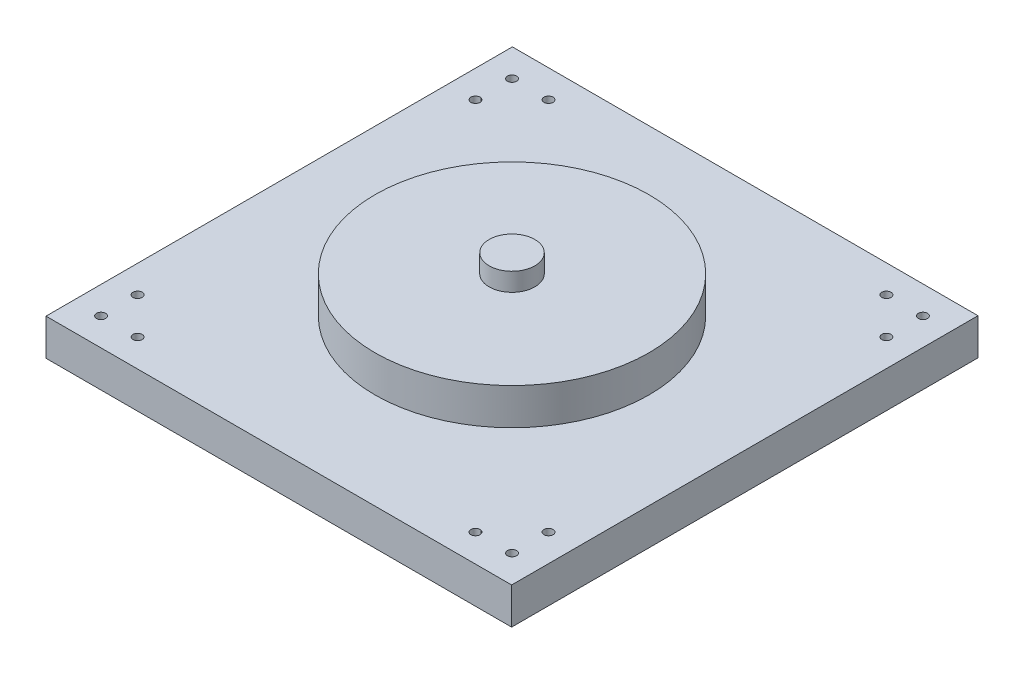
ISO-10303-21;
HEADER;
FILE_DESCRIPTION(('STEP AP214'),'2;1');
FILE_NAME('part.step','',(''),(''),'','','');
FILE_SCHEMA(('AUTOMOTIVE_DESIGN { 1 0 10303 214 1 1 1 1 }'));
ENDSEC;
DATA;
#1=APPLICATION_CONTEXT('core data for automotive mechanical design processes');
#2=APPLICATION_PROTOCOL_DEFINITION('international standard','automotive_design',2000,#1);
#3=PRODUCT_CONTEXT('',#1,'mechanical');
#4=PRODUCT('Part','Part','',(#3));
#5=PRODUCT_RELATED_PRODUCT_CATEGORY('part','',(#4));
#6=PRODUCT_DEFINITION_FORMATION('','',#4);
#7=PRODUCT_DEFINITION_CONTEXT('part definition',#1,'design');
#8=PRODUCT_DEFINITION('design','',#6,#7);
#9=PRODUCT_DEFINITION_SHAPE('','',#8);
#10=(LENGTH_UNIT() NAMED_UNIT(*) SI_UNIT(.MILLI.,.METRE.));
#11=(NAMED_UNIT(*) PLANE_ANGLE_UNIT() SI_UNIT($,.RADIAN.));
#12=(NAMED_UNIT(*) SI_UNIT($,.STERADIAN.) SOLID_ANGLE_UNIT());
#13=UNCERTAINTY_MEASURE_WITH_UNIT(LENGTH_MEASURE(1.E-05),#10,'distance_accuracy_value','');
#14=(GEOMETRIC_REPRESENTATION_CONTEXT(3) GLOBAL_UNCERTAINTY_ASSIGNED_CONTEXT((#13)) GLOBAL_UNIT_ASSIGNED_CONTEXT((#10,
#11,#12)) REPRESENTATION_CONTEXT('',''));
#15=CARTESIAN_POINT('',(0.,0.,0.));
#16=DIRECTION('',(0.,0.,1.));
#17=DIRECTION('',(1.,0.,0.));
#18=AXIS2_PLACEMENT_3D('',#15,#16,#17);
#19=CARTESIAN_POINT('',(0.,5.08,0.));
#20=DIRECTION('',(0.,-1.,0.));
#21=DIRECTION('',(0.,0.,-1.));
#22=AXIS2_PLACEMENT_3D('',#19,#20,#21);
#23=PLANE('',#22);
#24=CARTESIAN_POINT('',(0.,5.08,0.));
#25=DIRECTION('',(0.,1.,0.));
#26=DIRECTION('',(0.,0.,1.));
#27=AXIS2_PLACEMENT_3D('',#24,#25,#26);
#28=CIRCLE('',#27,19.05);
#29=CARTESIAN_POINT('',(0.,5.08,19.05));
#30=VERTEX_POINT('',#29);
#31=EDGE_CURVE('E50',#30,#30,#28,.T.);
#32=ORIENTED_EDGE('',*,*,#31,.F.);
#33=EDGE_LOOP('',(#32));
#34=FACE_BOUND('',#33,.T.);
#35=DIRECTION('',(0.,0.,-1.));
#36=VECTOR('',#35,1.);
#37=CARTESIAN_POINT('',(32.37851115788,5.08,32.4304660476962));
#38=LINE('',#37,#36);
#39=CARTESIAN_POINT('',(32.37851115788,5.08,32.4304660476962));
#40=VERTEX_POINT('',#39);
#41=CARTESIAN_POINT('',(32.37851115788,5.08,-32.4304660476962));
#42=VERTEX_POINT('',#41);
#43=EDGE_CURVE('E98',#40,#42,#38,.T.);
#44=ORIENTED_EDGE('',*,*,#43,.T.);
#45=DIRECTION('',(-1.,0.,0.));
#46=VECTOR('',#45,1.);
#47=CARTESIAN_POINT('',(-32.37851115788,5.08,-32.4304660476962));
#48=LINE('',#47,#46);
#49=CARTESIAN_POINT('',(-32.37851115788,5.08,-32.4304660476962));
#50=VERTEX_POINT('',#49);
#51=EDGE_CURVE('E93',#42,#50,#48,.T.);
#52=ORIENTED_EDGE('',*,*,#51,.T.);
#53=DIRECTION('',(0.,0.,1.));
#54=VECTOR('',#53,1.);
#55=CARTESIAN_POINT('',(-32.37851115788,5.08,32.4304660476962));
#56=LINE('',#55,#54);
#57=CARTESIAN_POINT('',(-32.37851115788,5.08,32.4304660476962));
#58=VERTEX_POINT('',#57);
#59=EDGE_CURVE('E96',#50,#58,#56,.T.);
#60=ORIENTED_EDGE('',*,*,#59,.T.);
#61=DIRECTION('',(1.,0.,0.));
#62=VECTOR('',#61,1.);
#63=CARTESIAN_POINT('',(-32.37851115788,5.08,32.4304660476962));
#64=LINE('',#63,#62);
#65=EDGE_CURVE('E59',#58,#40,#64,.T.);
#66=ORIENTED_EDGE('',*,*,#65,.T.);
#67=EDGE_LOOP('',(#44,#52,#60,#66));
#68=FACE_BOUND('',#67,.T.);
#69=CARTESIAN_POINT('',(-28.575,5.08,-28.575));
#70=DIRECTION('',(0.,1.,0.));
#71=DIRECTION('',(0.,0.,1.));
#72=AXIS2_PLACEMENT_3D('',#69,#70,#71);
#73=CIRCLE('',#72,0.634999999999999);
#74=CARTESIAN_POINT('',(-28.575,5.08,-27.94));
#75=VERTEX_POINT('',#74);
#76=EDGE_CURVE('E116',#75,#75,#73,.T.);
#77=ORIENTED_EDGE('',*,*,#76,.F.);
#78=EDGE_LOOP('',(#77));
#79=FACE_BOUND('',#78,.T.);
#80=CARTESIAN_POINT('',(-23.495,5.08,-28.575));
#81=DIRECTION('',(0.,1.,0.));
#82=DIRECTION('',(0.,0.,1.));
#83=AXIS2_PLACEMENT_3D('',#80,#81,#82);
#84=CIRCLE('',#83,0.635000000000003);
#85=CARTESIAN_POINT('',(-23.495,5.08,-27.94));
#86=VERTEX_POINT('',#85);
#87=EDGE_CURVE('E137',#86,#86,#84,.T.);
#88=ORIENTED_EDGE('',*,*,#87,.F.);
#89=EDGE_LOOP('',(#88));
#90=FACE_BOUND('',#89,.T.);
#91=CARTESIAN_POINT('',(-28.575,5.08,-23.495));
#92=DIRECTION('',(0.,1.,0.));
#93=DIRECTION('',(0.,0.,1.));
#94=AXIS2_PLACEMENT_3D('',#91,#92,#93);
#95=CIRCLE('',#94,0.634999999999999);
#96=CARTESIAN_POINT('',(-28.575,5.08,-22.86));
#97=VERTEX_POINT('',#96);
#98=EDGE_CURVE('E143',#97,#97,#95,.T.);
#99=ORIENTED_EDGE('',*,*,#98,.F.);
#100=EDGE_LOOP('',(#99));
#101=FACE_BOUND('',#100,.T.);
#102=CARTESIAN_POINT('',(28.575,5.08,-28.575));
#103=DIRECTION('',(0.,1.,0.));
#104=DIRECTION('',(0.,0.,1.));
#105=AXIS2_PLACEMENT_3D('',#102,#103,#104);
#106=CIRCLE('',#105,0.634999999999995);
#107=CARTESIAN_POINT('',(28.575,5.08,-27.94));
#108=VERTEX_POINT('',#107);
#109=EDGE_CURVE('E149',#108,#108,#106,.T.);
#110=ORIENTED_EDGE('',*,*,#109,.F.);
#111=EDGE_LOOP('',(#110));
#112=FACE_BOUND('',#111,.T.);
#113=CARTESIAN_POINT('',(23.495,5.08,-28.575));
#114=DIRECTION('',(0.,1.,0.));
#115=DIRECTION('',(0.,0.,1.));
#116=AXIS2_PLACEMENT_3D('',#113,#114,#115);
#117=CIRCLE('',#116,0.634999999999995);
#118=CARTESIAN_POINT('',(23.495,5.08,-27.94));
#119=VERTEX_POINT('',#118);
#120=EDGE_CURVE('E156',#119,#119,#117,.T.);
#121=ORIENTED_EDGE('',*,*,#120,.F.);
#122=EDGE_LOOP('',(#121));
#123=FACE_BOUND('',#122,.T.);
#124=CARTESIAN_POINT('',(28.575,5.08,-23.495));
#125=DIRECTION('',(0.,1.,0.));
#126=DIRECTION('',(0.,0.,1.));
#127=AXIS2_PLACEMENT_3D('',#124,#125,#126);
#128=CIRCLE('',#127,0.635000000000003);
#129=CARTESIAN_POINT('',(28.575,5.08,-22.86));
#130=VERTEX_POINT('',#129);
#131=EDGE_CURVE('E163',#130,#130,#128,.T.);
#132=ORIENTED_EDGE('',*,*,#131,.F.);
#133=EDGE_LOOP('',(#132));
#134=FACE_BOUND('',#133,.T.);
#135=CARTESIAN_POINT('',(28.575,5.08,28.575));
#136=DIRECTION('',(0.,1.,0.));
#137=DIRECTION('',(0.,0.,1.));
#138=AXIS2_PLACEMENT_3D('',#135,#136,#137);
#139=CIRCLE('',#138,0.634999999999995);
#140=CARTESIAN_POINT('',(28.575,5.08,29.21));
#141=VERTEX_POINT('',#140);
#142=EDGE_CURVE('E170',#141,#141,#139,.T.);
#143=ORIENTED_EDGE('',*,*,#142,.F.);
#144=EDGE_LOOP('',(#143));
#145=FACE_BOUND('',#144,.T.);
#146=CARTESIAN_POINT('',(28.575,5.08,23.495));
#147=DIRECTION('',(0.,1.,0.));
#148=DIRECTION('',(0.,0.,1.));
#149=AXIS2_PLACEMENT_3D('',#146,#147,#148);
#150=CIRCLE('',#149,0.635000000000003);
#151=CARTESIAN_POINT('',(28.575,5.08,24.13));
#152=VERTEX_POINT('',#151);
#153=EDGE_CURVE('E177',#152,#152,#150,.T.);
#154=ORIENTED_EDGE('',*,*,#153,.F.);
#155=EDGE_LOOP('',(#154));
#156=FACE_BOUND('',#155,.T.);
#157=CARTESIAN_POINT('',(23.495,5.08,28.575));
#158=DIRECTION('',(0.,1.,0.));
#159=DIRECTION('',(0.,0.,1.));
#160=AXIS2_PLACEMENT_3D('',#157,#158,#159);
#161=CIRCLE('',#160,0.634999999999995);
#162=CARTESIAN_POINT('',(23.495,5.08,29.21));
#163=VERTEX_POINT('',#162);
#164=EDGE_CURVE('E183',#163,#163,#161,.T.);
#165=ORIENTED_EDGE('',*,*,#164,.F.);
#166=EDGE_LOOP('',(#165));
#167=FACE_BOUND('',#166,.T.);
#168=CARTESIAN_POINT('',(-28.575,5.08,28.575));
#169=DIRECTION('',(0.,1.,0.));
#170=DIRECTION('',(0.,0.,1.));
#171=AXIS2_PLACEMENT_3D('',#168,#169,#170);
#172=CIRCLE('',#171,0.634999999999999);
#173=CARTESIAN_POINT('',(-28.575,5.08,29.21));
#174=VERTEX_POINT('',#173);
#175=EDGE_CURVE('E189',#174,#174,#172,.T.);
#176=ORIENTED_EDGE('',*,*,#175,.F.);
#177=EDGE_LOOP('',(#176));
#178=FACE_BOUND('',#177,.T.);
#179=CARTESIAN_POINT('',(-28.575,5.08,23.495));
#180=DIRECTION('',(0.,1.,0.));
#181=DIRECTION('',(0.,0.,1.));
#182=AXIS2_PLACEMENT_3D('',#179,#180,#181);
#183=CIRCLE('',#182,0.634999999999999);
#184=CARTESIAN_POINT('',(-28.575,5.08,24.13));
#185=VERTEX_POINT('',#184);
#186=EDGE_CURVE('E196',#185,#185,#183,.T.);
#187=ORIENTED_EDGE('',*,*,#186,.F.);
#188=EDGE_LOOP('',(#187));
#189=FACE_BOUND('',#188,.T.);
#190=CARTESIAN_POINT('',(-23.495,5.08,28.575));
#191=DIRECTION('',(0.,1.,0.));
#192=DIRECTION('',(0.,0.,1.));
#193=AXIS2_PLACEMENT_3D('',#190,#191,#192);
#194=CIRCLE('',#193,0.634999999999999);
#195=CARTESIAN_POINT('',(-23.495,5.08,29.21));
#196=VERTEX_POINT('',#195);
#197=EDGE_CURVE('E203',#196,#196,#194,.T.);
#198=ORIENTED_EDGE('',*,*,#197,.F.);
#199=EDGE_LOOP('',(#198));
#200=FACE_BOUND('',#199,.T.);
#201=ADVANCED_FACE('F39',(#34,#68,#79,#90,#101,#112,#123,#134,#145,#156,#167,#178,#189,#200),
#23,.F.);
#202=CARTESIAN_POINT('',(0.,0.,0.));
#203=DIRECTION('',(0.,-1.,0.));
#204=DIRECTION('',(0.,0.,-1.));
#205=AXIS2_PLACEMENT_3D('',#202,#203,#204);
#206=PLANE('',#205);
#207=CARTESIAN_POINT('',(-28.575,0.,23.495));
#208=DIRECTION('',(0.,1.,0.));
#209=DIRECTION('',(0.,0.,1.));
#210=AXIS2_PLACEMENT_3D('',#207,#208,#209);
#211=CIRCLE('',#210,0.634999999999999);
#212=CARTESIAN_POINT('',(-28.575,0.,24.13));
#213=VERTEX_POINT('',#212);
#214=EDGE_CURVE('E199',#213,#213,#211,.T.);
#215=ORIENTED_EDGE('',*,*,#214,.T.);
#216=EDGE_LOOP('',(#215));
#217=FACE_BOUND('',#216,.T.);
#218=CARTESIAN_POINT('',(23.495,0.,28.575));
#219=DIRECTION('',(0.,1.,0.));
#220=DIRECTION('',(0.,0.,1.));
#221=AXIS2_PLACEMENT_3D('',#218,#219,#220);
#222=CIRCLE('',#221,0.634999999999995);
#223=CARTESIAN_POINT('',(23.495,0.,29.21));
#224=VERTEX_POINT('',#223);
#225=EDGE_CURVE('E186',#224,#224,#222,.T.);
#226=ORIENTED_EDGE('',*,*,#225,.T.);
#227=EDGE_LOOP('',(#226));
#228=FACE_BOUND('',#227,.T.);
#229=CARTESIAN_POINT('',(28.575,0.,28.575));
#230=DIRECTION('',(0.,1.,0.));
#231=DIRECTION('',(0.,0.,1.));
#232=AXIS2_PLACEMENT_3D('',#229,#230,#231);
#233=CIRCLE('',#232,0.634999999999995);
#234=CARTESIAN_POINT('',(28.575,0.,29.21));
#235=VERTEX_POINT('',#234);
#236=EDGE_CURVE('E174',#235,#235,#233,.T.);
#237=ORIENTED_EDGE('',*,*,#236,.T.);
#238=EDGE_LOOP('',(#237));
#239=FACE_BOUND('',#238,.T.);
#240=CARTESIAN_POINT('',(23.495,0.,-28.575));
#241=DIRECTION('',(0.,1.,0.));
#242=DIRECTION('',(0.,0.,1.));
#243=AXIS2_PLACEMENT_3D('',#240,#241,#242);
#244=CIRCLE('',#243,0.634999999999995);
#245=CARTESIAN_POINT('',(23.495,0.,-27.94));
#246=VERTEX_POINT('',#245);
#247=EDGE_CURVE('E160',#246,#246,#244,.T.);
#248=ORIENTED_EDGE('',*,*,#247,.T.);
#249=EDGE_LOOP('',(#248));
#250=FACE_BOUND('',#249,.T.);
#251=CARTESIAN_POINT('',(-28.575,0.,-23.495));
#252=DIRECTION('',(0.,1.,0.));
#253=DIRECTION('',(0.,0.,1.));
#254=AXIS2_PLACEMENT_3D('',#251,#252,#253);
#255=CIRCLE('',#254,0.634999999999999);
#256=CARTESIAN_POINT('',(-28.575,0.,-22.86));
#257=VERTEX_POINT('',#256);
#258=EDGE_CURVE('E146',#257,#257,#255,.T.);
#259=ORIENTED_EDGE('',*,*,#258,.T.);
#260=EDGE_LOOP('',(#259));
#261=FACE_BOUND('',#260,.T.);
#262=CARTESIAN_POINT('',(-28.575,0.,-28.575));
#263=DIRECTION('',(0.,1.,0.));
#264=DIRECTION('',(0.,0.,1.));
#265=AXIS2_PLACEMENT_3D('',#262,#263,#264);
#266=CIRCLE('',#265,0.634999999999999);
#267=CARTESIAN_POINT('',(-28.575,0.,-27.94));
#268=VERTEX_POINT('',#267);
#269=EDGE_CURVE('E134',#268,#268,#266,.T.);
#270=ORIENTED_EDGE('',*,*,#269,.T.);
#271=EDGE_LOOP('',(#270));
#272=FACE_BOUND('',#271,.T.);
#273=DIRECTION('',(0.,0.,-1.));
#274=VECTOR('',#273,1.);
#275=CARTESIAN_POINT('',(32.37851115788,0.,32.4304660476962));
#276=LINE('',#275,#274);
#277=CARTESIAN_POINT('',(32.37851115788,0.,32.4304660476962));
#278=VERTEX_POINT('',#277);
#279=CARTESIAN_POINT('',(32.37851115788,0.,-32.4304660476962));
#280=VERTEX_POINT('',#279);
#281=EDGE_CURVE('E112',#278,#280,#276,.T.);
#282=ORIENTED_EDGE('',*,*,#281,.F.);
#283=DIRECTION('',(1.,0.,0.));
#284=VECTOR('',#283,1.);
#285=CARTESIAN_POINT('',(-32.37851115788,0.,32.4304660476962));
#286=LINE('',#285,#284);
#287=CARTESIAN_POINT('',(-32.37851115788,0.,32.4304660476962));
#288=VERTEX_POINT('',#287);
#289=EDGE_CURVE('E84',#288,#278,#286,.T.);
#290=ORIENTED_EDGE('',*,*,#289,.F.);
#291=DIRECTION('',(0.,0.,1.));
#292=VECTOR('',#291,1.);
#293=CARTESIAN_POINT('',(-32.37851115788,0.,32.4304660476962));
#294=LINE('',#293,#292);
#295=CARTESIAN_POINT('',(-32.37851115788,0.,-32.4304660476962));
#296=VERTEX_POINT('',#295);
#297=EDGE_CURVE('E78',#296,#288,#294,.T.);
#298=ORIENTED_EDGE('',*,*,#297,.F.);
#299=DIRECTION('',(-1.,0.,0.));
#300=VECTOR('',#299,1.);
#301=CARTESIAN_POINT('',(-32.37851115788,0.,-32.4304660476962));
#302=LINE('',#301,#300);
#303=EDGE_CURVE('E104',#280,#296,#302,.T.);
#304=ORIENTED_EDGE('',*,*,#303,.F.);
#305=EDGE_LOOP('',(#282,#290,#298,#304));
#306=FACE_BOUND('',#305,.T.);
#307=CARTESIAN_POINT('',(-23.495,0.,-28.575));
#308=DIRECTION('',(0.,1.,0.));
#309=DIRECTION('',(0.,0.,1.));
#310=AXIS2_PLACEMENT_3D('',#307,#308,#309);
#311=CIRCLE('',#310,0.635000000000003);
#312=CARTESIAN_POINT('',(-23.495,0.,-27.94));
#313=VERTEX_POINT('',#312);
#314=EDGE_CURVE('E140',#313,#313,#311,.T.);
#315=ORIENTED_EDGE('',*,*,#314,.T.);
#316=EDGE_LOOP('',(#315));
#317=FACE_BOUND('',#316,.T.);
#318=CARTESIAN_POINT('',(28.575,0.,-28.575));
#319=DIRECTION('',(0.,1.,0.));
#320=DIRECTION('',(0.,0.,1.));
#321=AXIS2_PLACEMENT_3D('',#318,#319,#320);
#322=CIRCLE('',#321,0.634999999999995);
#323=CARTESIAN_POINT('',(28.575,0.,-27.94));
#324=VERTEX_POINT('',#323);
#325=EDGE_CURVE('E152',#324,#324,#322,.T.);
#326=ORIENTED_EDGE('',*,*,#325,.T.);
#327=EDGE_LOOP('',(#326));
#328=FACE_BOUND('',#327,.T.);
#329=CARTESIAN_POINT('',(28.575,0.,-23.495));
#330=DIRECTION('',(0.,1.,0.));
#331=DIRECTION('',(0.,0.,1.));
#332=AXIS2_PLACEMENT_3D('',#329,#330,#331);
#333=CIRCLE('',#332,0.635000000000003);
#334=CARTESIAN_POINT('',(28.575,0.,-22.86));
#335=VERTEX_POINT('',#334);
#336=EDGE_CURVE('E166',#335,#335,#333,.T.);
#337=ORIENTED_EDGE('',*,*,#336,.T.);
#338=EDGE_LOOP('',(#337));
#339=FACE_BOUND('',#338,.T.);
#340=CARTESIAN_POINT('',(28.575,0.,23.495));
#341=DIRECTION('',(0.,1.,0.));
#342=DIRECTION('',(0.,0.,1.));
#343=AXIS2_PLACEMENT_3D('',#340,#341,#342);
#344=CIRCLE('',#343,0.635000000000003);
#345=CARTESIAN_POINT('',(28.575,0.,24.13));
#346=VERTEX_POINT('',#345);
#347=EDGE_CURVE('E180',#346,#346,#344,.T.);
#348=ORIENTED_EDGE('',*,*,#347,.T.);
#349=EDGE_LOOP('',(#348));
#350=FACE_BOUND('',#349,.T.);
#351=CARTESIAN_POINT('',(-28.575,0.,28.575));
#352=DIRECTION('',(0.,1.,0.));
#353=DIRECTION('',(0.,0.,1.));
#354=AXIS2_PLACEMENT_3D('',#351,#352,#353);
#355=CIRCLE('',#354,0.634999999999999);
#356=CARTESIAN_POINT('',(-28.575,0.,29.21));
#357=VERTEX_POINT('',#356);
#358=EDGE_CURVE('E192',#357,#357,#355,.T.);
#359=ORIENTED_EDGE('',*,*,#358,.T.);
#360=EDGE_LOOP('',(#359));
#361=FACE_BOUND('',#360,.T.);
#362=CARTESIAN_POINT('',(-23.495,0.,28.575));
#363=DIRECTION('',(0.,1.,0.));
#364=DIRECTION('',(0.,0.,1.));
#365=AXIS2_PLACEMENT_3D('',#362,#363,#364);
#366=CIRCLE('',#365,0.634999999999999);
#367=CARTESIAN_POINT('',(-23.495,0.,29.21));
#368=VERTEX_POINT('',#367);
#369=EDGE_CURVE('E207',#368,#368,#366,.T.);
#370=ORIENTED_EDGE('',*,*,#369,.T.);
#371=EDGE_LOOP('',(#370));
#372=FACE_BOUND('',#371,.T.);
#373=ADVANCED_FACE('F129',(#217,#228,#239,#250,#261,#272,#306,#317,#328,#339,#350,#361,#372),
#206,.T.);
#374=CARTESIAN_POINT('',(32.37851115788,5.08,32.4304660476962));
#375=DIRECTION('',(-1.,0.,0.));
#376=DIRECTION('',(0.,0.,1.));
#377=AXIS2_PLACEMENT_3D('',#374,#375,#376);
#378=PLANE('',#377);
#379=ORIENTED_EDGE('',*,*,#281,.T.);
#380=DIRECTION('',(0.,-1.,0.));
#381=VECTOR('',#380,1.);
#382=CARTESIAN_POINT('',(32.37851115788,5.08,-32.4304660476962));
#383=LINE('',#382,#381);
#384=EDGE_CURVE('E43',#42,#280,#383,.T.);
#385=ORIENTED_EDGE('',*,*,#384,.F.);
#386=ORIENTED_EDGE('',*,*,#43,.F.);
#387=DIRECTION('',(0.,-1.,0.));
#388=VECTOR('',#387,1.);
#389=CARTESIAN_POINT('',(32.37851115788,5.08,32.4304660476962));
#390=LINE('',#389,#388);
#391=EDGE_CURVE('E108',#40,#278,#390,.T.);
#392=ORIENTED_EDGE('',*,*,#391,.T.);
#393=EDGE_LOOP('',(#379,#385,#386,#392));
#394=FACE_BOUND('',#393,.T.);
#395=ADVANCED_FACE('F41',(#394),#378,.F.);
#396=CARTESIAN_POINT('',(-32.37851115788,5.08,-32.4304660476962));
#397=DIRECTION('',(0.,0.,1.));
#398=DIRECTION('',(1.,0.,0.));
#399=AXIS2_PLACEMENT_3D('',#396,#397,#398);
#400=PLANE('',#399);
#401=ORIENTED_EDGE('',*,*,#303,.T.);
#402=DIRECTION('',(0.,-1.,0.));
#403=VECTOR('',#402,1.);
#404=CARTESIAN_POINT('',(-32.37851115788,5.08,-32.4304660476962));
#405=LINE('',#404,#403);
#406=EDGE_CURVE('E102',#50,#296,#405,.T.);
#407=ORIENTED_EDGE('',*,*,#406,.F.);
#408=ORIENTED_EDGE('',*,*,#51,.F.);
#409=ORIENTED_EDGE('',*,*,#384,.T.);
#410=EDGE_LOOP('',(#401,#407,#408,#409));
#411=FACE_BOUND('',#410,.T.);
#412=ADVANCED_FACE('F103',(#411),#400,.F.);
#413=CARTESIAN_POINT('',(-32.37851115788,5.08,32.4304660476962));
#414=DIRECTION('',(1.,0.,0.));
#415=DIRECTION('',(0.,0.,-1.));
#416=AXIS2_PLACEMENT_3D('',#413,#414,#415);
#417=PLANE('',#416);
#418=ORIENTED_EDGE('',*,*,#297,.T.);
#419=DIRECTION('',(0.,-1.,0.));
#420=VECTOR('',#419,1.);
#421=CARTESIAN_POINT('',(-32.37851115788,5.08,32.4304660476962));
#422=LINE('',#421,#420);
#423=EDGE_CURVE('E105',#58,#288,#422,.T.);
#424=ORIENTED_EDGE('',*,*,#423,.F.);
#425=ORIENTED_EDGE('',*,*,#59,.F.);
#426=ORIENTED_EDGE('',*,*,#406,.T.);
#427=EDGE_LOOP('',(#418,#424,#425,#426));
#428=FACE_BOUND('',#427,.T.);
#429=ADVANCED_FACE('F106',(#428),#417,.F.);
#430=CARTESIAN_POINT('',(-32.37851115788,5.08,32.4304660476962));
#431=DIRECTION('',(0.,0.,-1.));
#432=DIRECTION('',(-1.,0.,0.));
#433=AXIS2_PLACEMENT_3D('',#430,#431,#432);
#434=PLANE('',#433);
#435=ORIENTED_EDGE('',*,*,#289,.T.);
#436=ORIENTED_EDGE('',*,*,#391,.F.);
#437=ORIENTED_EDGE('',*,*,#65,.F.);
#438=ORIENTED_EDGE('',*,*,#423,.T.);
#439=EDGE_LOOP('',(#435,#436,#437,#438));
#440=FACE_BOUND('',#439,.T.);
#441=ADVANCED_FACE('F126',(#440),#434,.F.);
#442=CARTESIAN_POINT('',(-28.575,5.08,-28.575));
#443=DIRECTION('',(0.,-1.,0.));
#444=DIRECTION('',(0.,0.,-1.));
#445=AXIS2_PLACEMENT_3D('',#442,#443,#444);
#446=CYLINDRICAL_SURFACE('',#445,0.634999999999999);
#447=ORIENTED_EDGE('',*,*,#76,.T.);
#448=EDGE_LOOP('',(#447));
#449=FACE_BOUND('',#448,.T.);
#450=ORIENTED_EDGE('',*,*,#269,.F.);
#451=EDGE_LOOP('',(#450));
#452=FACE_BOUND('',#451,.T.);
#453=ADVANCED_FACE('F255',(#449,#452),#446,.F.);
#454=CARTESIAN_POINT('',(-23.495,5.08,-28.575));
#455=DIRECTION('',(0.,-1.,0.));
#456=DIRECTION('',(0.,0.,-1.));
#457=AXIS2_PLACEMENT_3D('',#454,#455,#456);
#458=CYLINDRICAL_SURFACE('',#457,0.635000000000003);
#459=ORIENTED_EDGE('',*,*,#87,.T.);
#460=EDGE_LOOP('',(#459));
#461=FACE_BOUND('',#460,.T.);
#462=ORIENTED_EDGE('',*,*,#314,.F.);
#463=EDGE_LOOP('',(#462));
#464=FACE_BOUND('',#463,.T.);
#465=ADVANCED_FACE('F377',(#461,#464),#458,.F.);
#466=CARTESIAN_POINT('',(-28.575,5.08,-23.495));
#467=DIRECTION('',(0.,-1.,0.));
#468=DIRECTION('',(0.,0.,-1.));
#469=AXIS2_PLACEMENT_3D('',#466,#467,#468);
#470=CYLINDRICAL_SURFACE('',#469,0.634999999999999);
#471=ORIENTED_EDGE('',*,*,#98,.T.);
#472=EDGE_LOOP('',(#471));
#473=FACE_BOUND('',#472,.T.);
#474=ORIENTED_EDGE('',*,*,#258,.F.);
#475=EDGE_LOOP('',(#474));
#476=FACE_BOUND('',#475,.T.);
#477=ADVANCED_FACE('F369',(#473,#476),#470,.F.);
#478=CARTESIAN_POINT('',(28.575,5.08,-28.575));
#479=DIRECTION('',(0.,-1.,0.));
#480=DIRECTION('',(0.,0.,-1.));
#481=AXIS2_PLACEMENT_3D('',#478,#479,#480);
#482=CYLINDRICAL_SURFACE('',#481,0.634999999999995);
#483=ORIENTED_EDGE('',*,*,#109,.T.);
#484=EDGE_LOOP('',(#483));
#485=FACE_BOUND('',#484,.T.);
#486=ORIENTED_EDGE('',*,*,#325,.F.);
#487=EDGE_LOOP('',(#486));
#488=FACE_BOUND('',#487,.T.);
#489=ADVANCED_FACE('F361',(#485,#488),#482,.F.);
#490=CARTESIAN_POINT('',(23.495,5.08,-28.575));
#491=DIRECTION('',(0.,-1.,0.));
#492=DIRECTION('',(0.,0.,-1.));
#493=AXIS2_PLACEMENT_3D('',#490,#491,#492);
#494=CYLINDRICAL_SURFACE('',#493,0.634999999999995);
#495=ORIENTED_EDGE('',*,*,#120,.T.);
#496=EDGE_LOOP('',(#495));
#497=FACE_BOUND('',#496,.T.);
#498=ORIENTED_EDGE('',*,*,#247,.F.);
#499=EDGE_LOOP('',(#498));
#500=FACE_BOUND('',#499,.T.);
#501=ADVANCED_FACE('F353',(#497,#500),#494,.F.);
#502=CARTESIAN_POINT('',(28.575,5.08,-23.495));
#503=DIRECTION('',(0.,-1.,0.));
#504=DIRECTION('',(0.,0.,-1.));
#505=AXIS2_PLACEMENT_3D('',#502,#503,#504);
#506=CYLINDRICAL_SURFACE('',#505,0.635000000000003);
#507=ORIENTED_EDGE('',*,*,#131,.T.);
#508=EDGE_LOOP('',(#507));
#509=FACE_BOUND('',#508,.T.);
#510=ORIENTED_EDGE('',*,*,#336,.F.);
#511=EDGE_LOOP('',(#510));
#512=FACE_BOUND('',#511,.T.);
#513=ADVANCED_FACE('F345',(#509,#512),#506,.F.);
#514=CARTESIAN_POINT('',(28.575,5.08,28.575));
#515=DIRECTION('',(0.,-1.,0.));
#516=DIRECTION('',(0.,0.,-1.));
#517=AXIS2_PLACEMENT_3D('',#514,#515,#516);
#518=CYLINDRICAL_SURFACE('',#517,0.634999999999995);
#519=ORIENTED_EDGE('',*,*,#142,.T.);
#520=EDGE_LOOP('',(#519));
#521=FACE_BOUND('',#520,.T.);
#522=ORIENTED_EDGE('',*,*,#236,.F.);
#523=EDGE_LOOP('',(#522));
#524=FACE_BOUND('',#523,.T.);
#525=ADVANCED_FACE('F337',(#521,#524),#518,.F.);
#526=CARTESIAN_POINT('',(28.575,5.08,23.495));
#527=DIRECTION('',(0.,-1.,0.));
#528=DIRECTION('',(0.,0.,-1.));
#529=AXIS2_PLACEMENT_3D('',#526,#527,#528);
#530=CYLINDRICAL_SURFACE('',#529,0.635000000000003);
#531=ORIENTED_EDGE('',*,*,#153,.T.);
#532=EDGE_LOOP('',(#531));
#533=FACE_BOUND('',#532,.T.);
#534=ORIENTED_EDGE('',*,*,#347,.F.);
#535=EDGE_LOOP('',(#534));
#536=FACE_BOUND('',#535,.T.);
#537=ADVANCED_FACE('F329',(#533,#536),#530,.F.);
#538=CARTESIAN_POINT('',(23.495,5.08,28.575));
#539=DIRECTION('',(0.,-1.,0.));
#540=DIRECTION('',(0.,0.,-1.));
#541=AXIS2_PLACEMENT_3D('',#538,#539,#540);
#542=CYLINDRICAL_SURFACE('',#541,0.634999999999995);
#543=ORIENTED_EDGE('',*,*,#164,.T.);
#544=EDGE_LOOP('',(#543));
#545=FACE_BOUND('',#544,.T.);
#546=ORIENTED_EDGE('',*,*,#225,.F.);
#547=EDGE_LOOP('',(#546));
#548=FACE_BOUND('',#547,.T.);
#549=ADVANCED_FACE('F321',(#545,#548),#542,.F.);
#550=CARTESIAN_POINT('',(-28.575,5.08,28.575));
#551=DIRECTION('',(0.,-1.,0.));
#552=DIRECTION('',(0.,0.,-1.));
#553=AXIS2_PLACEMENT_3D('',#550,#551,#552);
#554=CYLINDRICAL_SURFACE('',#553,0.634999999999999);
#555=ORIENTED_EDGE('',*,*,#175,.T.);
#556=EDGE_LOOP('',(#555));
#557=FACE_BOUND('',#556,.T.);
#558=ORIENTED_EDGE('',*,*,#358,.F.);
#559=EDGE_LOOP('',(#558));
#560=FACE_BOUND('',#559,.T.);
#561=ADVANCED_FACE('F313',(#557,#560),#554,.F.);
#562=CARTESIAN_POINT('',(-28.575,5.08,23.495));
#563=DIRECTION('',(0.,-1.,0.));
#564=DIRECTION('',(0.,0.,-1.));
#565=AXIS2_PLACEMENT_3D('',#562,#563,#564);
#566=CYLINDRICAL_SURFACE('',#565,0.634999999999999);
#567=ORIENTED_EDGE('',*,*,#186,.T.);
#568=EDGE_LOOP('',(#567));
#569=FACE_BOUND('',#568,.T.);
#570=ORIENTED_EDGE('',*,*,#214,.F.);
#571=EDGE_LOOP('',(#570));
#572=FACE_BOUND('',#571,.T.);
#573=ADVANCED_FACE('F305',(#569,#572),#566,.F.);
#574=CARTESIAN_POINT('',(-23.495,5.08,28.575));
#575=DIRECTION('',(0.,-1.,0.));
#576=DIRECTION('',(0.,0.,-1.));
#577=AXIS2_PLACEMENT_3D('',#574,#575,#576);
#578=CYLINDRICAL_SURFACE('',#577,0.634999999999999);
#579=ORIENTED_EDGE('',*,*,#197,.T.);
#580=EDGE_LOOP('',(#579));
#581=FACE_BOUND('',#580,.T.);
#582=ORIENTED_EDGE('',*,*,#369,.F.);
#583=EDGE_LOOP('',(#582));
#584=FACE_BOUND('',#583,.T.);
#585=ADVANCED_FACE('F243',(#581,#584),#578,.F.);
#586=CARTESIAN_POINT('',(0.,10.16,0.));
#587=DIRECTION('',(0.,-1.,0.));
#588=DIRECTION('',(0.,0.,-1.));
#589=AXIS2_PLACEMENT_3D('',#586,#587,#588);
#590=CYLINDRICAL_SURFACE('',#589,19.05);
#591=CARTESIAN_POINT('',(0.,10.16,0.));
#592=DIRECTION('',(0.,1.,0.));
#593=DIRECTION('',(0.,0.,1.));
#594=AXIS2_PLACEMENT_3D('',#591,#592,#593);
#595=CIRCLE('',#594,19.05);
#596=CARTESIAN_POINT('',(0.,10.16,19.05));
#597=VERTEX_POINT('',#596);
#598=EDGE_CURVE('E211',#597,#597,#595,.T.);
#599=ORIENTED_EDGE('',*,*,#598,.F.);
#600=EDGE_LOOP('',(#599));
#601=FACE_BOUND('',#600,.T.);
#602=ORIENTED_EDGE('',*,*,#31,.T.);
#603=EDGE_LOOP('',(#602));
#604=FACE_BOUND('',#603,.T.);
#605=ADVANCED_FACE('F237',(#601,#604),#590,.T.);
#606=CARTESIAN_POINT('',(0.,10.16,0.));
#607=DIRECTION('',(0.,1.,0.));
#608=DIRECTION('',(0.,0.,1.));
#609=AXIS2_PLACEMENT_3D('',#606,#607,#608);
#610=PLANE('',#609);
#611=CARTESIAN_POINT('',(0.,10.16,0.));
#612=DIRECTION('',(0.,1.,0.));
#613=DIRECTION('',(0.,0.,1.));
#614=AXIS2_PLACEMENT_3D('',#611,#612,#613);
#615=CIRCLE('',#614,3.175);
#616=CARTESIAN_POINT('',(0.,10.16,3.175));
#617=VERTEX_POINT('',#616);
#618=EDGE_CURVE('E11',#617,#617,#615,.T.);
#619=ORIENTED_EDGE('',*,*,#618,.F.);
#620=EDGE_LOOP('',(#619));
#621=FACE_BOUND('',#620,.T.);
#622=ORIENTED_EDGE('',*,*,#598,.T.);
#623=EDGE_LOOP('',(#622));
#624=FACE_BOUND('',#623,.T.);
#625=ADVANCED_FACE('F231',(#621,#624),#610,.T.);
#626=CARTESIAN_POINT('',(0.,12.7,0.));
#627=DIRECTION('',(0.,-1.,0.));
#628=DIRECTION('',(0.,0.,-1.));
#629=AXIS2_PLACEMENT_3D('',#626,#627,#628);
#630=CYLINDRICAL_SURFACE('',#629,3.175);
#631=CARTESIAN_POINT('',(0.,12.7,0.));
#632=DIRECTION('',(0.,1.,0.));
#633=DIRECTION('',(0.,0.,1.));
#634=AXIS2_PLACEMENT_3D('',#631,#632,#633);
#635=CIRCLE('',#634,3.175);
#636=CARTESIAN_POINT('',(0.,12.7,3.175));
#637=VERTEX_POINT('',#636);
#638=EDGE_CURVE('E220',#637,#637,#635,.T.);
#639=ORIENTED_EDGE('',*,*,#638,.F.);
#640=EDGE_LOOP('',(#639));
#641=FACE_BOUND('',#640,.T.);
#642=ORIENTED_EDGE('',*,*,#618,.T.);
#643=EDGE_LOOP('',(#642));
#644=FACE_BOUND('',#643,.T.);
#645=ADVANCED_FACE('F228',(#641,#644),#630,.T.);
#646=CARTESIAN_POINT('',(0.,12.7,0.));
#647=DIRECTION('',(0.,1.,0.));
#648=DIRECTION('',(0.,0.,1.));
#649=AXIS2_PLACEMENT_3D('',#646,#647,#648);
#650=PLANE('',#649);
#651=ORIENTED_EDGE('',*,*,#638,.T.);
#652=EDGE_LOOP('',(#651));
#653=FACE_BOUND('',#652,.T.);
#654=ADVANCED_FACE('F226',(#653),#650,.T.);
#655=CLOSED_SHELL('',(#201,#373,#395,#412,#429,#441,#453,#465,#477,#489,#501,#513,#525,#537,
#549,#561,#573,#585,#605,#625,#645,#654));
#656=MANIFOLD_SOLID_BREP('B2',#655);
#657=ADVANCED_BREP_SHAPE_REPRESENTATION('',(#18,#656),#14);
#658=SHAPE_DEFINITION_REPRESENTATION(#9,#657);
ENDSEC;
END-ISO-10303-21;
